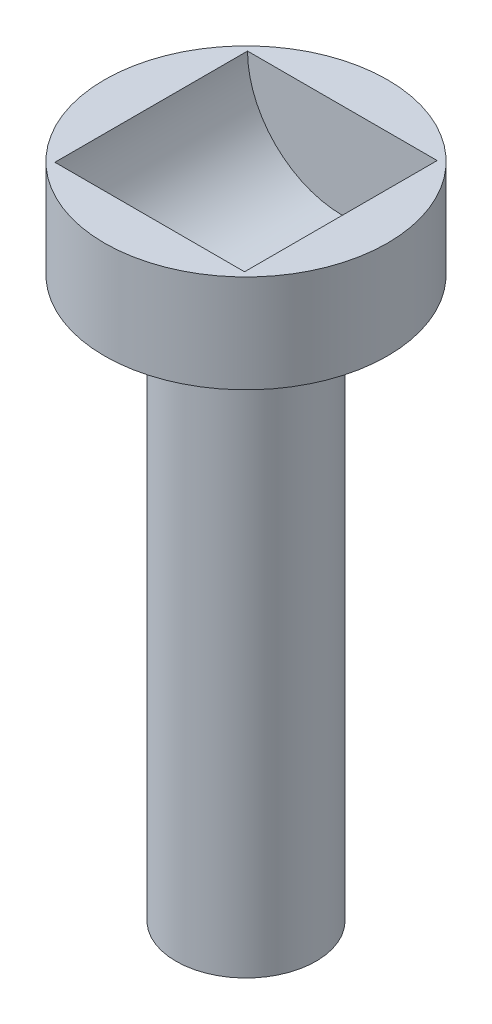
ISO-10303-21;
HEADER;
FILE_DESCRIPTION(('STEP AP214'),'2;1');
FILE_NAME('part.step','',(''),(''),'','','');
FILE_SCHEMA(('AUTOMOTIVE_DESIGN { 1 0 10303 214 1 1 1 1 }'));
ENDSEC;
DATA;
#1=APPLICATION_CONTEXT('core data for automotive mechanical design processes');
#2=APPLICATION_PROTOCOL_DEFINITION('international standard','automotive_design',2000,#1);
#3=PRODUCT_CONTEXT('',#1,'mechanical');
#4=PRODUCT('Part','Part','',(#3));
#5=PRODUCT_RELATED_PRODUCT_CATEGORY('part','',(#4));
#6=PRODUCT_DEFINITION_FORMATION('','',#4);
#7=PRODUCT_DEFINITION_CONTEXT('part definition',#1,'design');
#8=PRODUCT_DEFINITION('design','',#6,#7);
#9=PRODUCT_DEFINITION_SHAPE('','',#8);
#10=(LENGTH_UNIT() NAMED_UNIT(*) SI_UNIT(.MILLI.,.METRE.));
#11=(NAMED_UNIT(*) PLANE_ANGLE_UNIT() SI_UNIT($,.RADIAN.));
#12=(NAMED_UNIT(*) SI_UNIT($,.STERADIAN.) SOLID_ANGLE_UNIT());
#13=UNCERTAINTY_MEASURE_WITH_UNIT(LENGTH_MEASURE(1.E-05),#10,'distance_accuracy_value','');
#14=(GEOMETRIC_REPRESENTATION_CONTEXT(3) GLOBAL_UNCERTAINTY_ASSIGNED_CONTEXT((#13)) GLOBAL_UNIT_ASSIGNED_CONTEXT((#10,
#11,#12)) REPRESENTATION_CONTEXT('',''));
#15=CARTESIAN_POINT('',(0.,0.,0.));
#16=DIRECTION('',(0.,0.,1.));
#17=DIRECTION('',(1.,0.,0.));
#18=AXIS2_PLACEMENT_3D('',#15,#16,#17);
#19=CARTESIAN_POINT('',(0.,20.,0.));
#20=DIRECTION('',(0.,-1.,0.));
#21=DIRECTION('',(0.,0.,-1.));
#22=AXIS2_PLACEMENT_3D('',#19,#20,#21);
#23=CYLINDRICAL_SURFACE('',#22,2.4);
#24=CARTESIAN_POINT('',(0.,0.,0.));
#25=DIRECTION('',(0.,1.,0.));
#26=DIRECTION('',(0.,0.,1.));
#27=AXIS2_PLACEMENT_3D('',#24,#25,#26);
#28=CIRCLE('',#27,2.4);
#29=CARTESIAN_POINT('',(0.,0.,2.4));
#30=VERTEX_POINT('',#29);
#31=EDGE_CURVE('E74',#30,#30,#28,.T.);
#32=ORIENTED_EDGE('',*,*,#31,.T.);
#33=EDGE_LOOP('',(#32));
#34=FACE_BOUND('',#33,.T.);
#35=CARTESIAN_POINT('',(0.,19.19,0.));
#36=DIRECTION('',(0.,1.,0.));
#37=DIRECTION('',(0.,0.,1.));
#38=AXIS2_PLACEMENT_3D('',#35,#36,#37);
#39=CIRCLE('',#38,2.4);
#40=CARTESIAN_POINT('',(0.,19.19,2.4));
#41=VERTEX_POINT('',#40);
#42=EDGE_CURVE('E62',#41,#41,#39,.T.);
#43=ORIENTED_EDGE('',*,*,#42,.F.);
#44=EDGE_LOOP('',(#43));
#45=FACE_BOUND('',#44,.T.);
#46=ADVANCED_FACE('F32',(#34,#45),#23,.T.);
#47=CARTESIAN_POINT('',(0.,0.,0.));
#48=DIRECTION('',(0.,1.,0.));
#49=DIRECTION('',(0.,0.,1.));
#50=AXIS2_PLACEMENT_3D('',#47,#48,#49);
#51=PLANE('',#50);
#52=CARTESIAN_POINT('',(0.,0.,0.));
#53=DIRECTION('',(0.,-1.,0.));
#54=DIRECTION('',(0.,0.,-1.));
#55=AXIS2_PLACEMENT_3D('',#52,#53,#54);
#56=CIRCLE('',#55,1.195);
#57=CARTESIAN_POINT('',(0.,0.,-1.195));
#58=VERTEX_POINT('',#57);
#59=EDGE_CURVE('E78',#58,#58,#56,.T.);
#60=ORIENTED_EDGE('',*,*,#59,.F.);
#61=EDGE_LOOP('',(#60));
#62=FACE_BOUND('',#61,.T.);
#63=ORIENTED_EDGE('',*,*,#31,.F.);
#64=EDGE_LOOP('',(#63));
#65=FACE_BOUND('',#64,.T.);
#66=ADVANCED_FACE('F101',(#62,#65),#51,.F.);
#67=CARTESIAN_POINT('',(0.,10.,0.));
#68=DIRECTION('',(0.,-1.,0.));
#69=DIRECTION('',(0.,0.,-1.));
#70=AXIS2_PLACEMENT_3D('',#67,#68,#69);
#71=CYLINDRICAL_SURFACE('',#70,1.195);
#72=CARTESIAN_POINT('',(0.,10.,0.));
#73=DIRECTION('',(0.,-1.,0.));
#74=DIRECTION('',(0.,0.,-1.));
#75=AXIS2_PLACEMENT_3D('',#72,#73,#74);
#76=CIRCLE('',#75,1.195);
#77=CARTESIAN_POINT('',(0.,10.,-1.195));
#78=VERTEX_POINT('',#77);
#79=EDGE_CURVE('E77',#78,#78,#76,.T.);
#80=ORIENTED_EDGE('',*,*,#79,.F.);
#81=EDGE_LOOP('',(#80));
#82=FACE_BOUND('',#81,.T.);
#83=ORIENTED_EDGE('',*,*,#59,.T.);
#84=EDGE_LOOP('',(#83));
#85=FACE_BOUND('',#84,.T.);
#86=ADVANCED_FACE('F106',(#82,#85),#71,.F.);
#87=CARTESIAN_POINT('',(0.,10.,0.));
#88=DIRECTION('',(0.,-1.,0.));
#89=DIRECTION('',(0.,0.,-1.));
#90=AXIS2_PLACEMENT_3D('',#87,#88,#89);
#91=PLANE('',#90);
#92=ORIENTED_EDGE('',*,*,#79,.T.);
#93=EDGE_LOOP('',(#92));
#94=FACE_BOUND('',#93,.T.);
#95=ADVANCED_FACE('F114',(#94),#91,.T.);
#96=CARTESIAN_POINT('',(0.,19.19,0.));
#97=DIRECTION('',(0.,1.,0.));
#98=DIRECTION('',(0.,0.,1.));
#99=AXIS2_PLACEMENT_3D('',#96,#97,#98);
#100=PLANE('',#99);
#101=CARTESIAN_POINT('',(0.,19.19,0.));
#102=DIRECTION('',(0.,1.,0.));
#103=DIRECTION('',(0.,0.,1.));
#104=AXIS2_PLACEMENT_3D('',#101,#102,#103);
#105=CIRCLE('',#104,4.85);
#106=CARTESIAN_POINT('',(0.,19.19,4.85));
#107=VERTEX_POINT('',#106);
#108=EDGE_CURVE('E86',#107,#107,#105,.T.);
#109=ORIENTED_EDGE('',*,*,#108,.F.);
#110=EDGE_LOOP('',(#109));
#111=FACE_BOUND('',#110,.T.);
#112=ORIENTED_EDGE('',*,*,#42,.T.);
#113=EDGE_LOOP('',(#112));
#114=FACE_BOUND('',#113,.T.);
#115=ADVANCED_FACE('F112',(#111,#114),#100,.F.);
#116=CARTESIAN_POINT('',(0.,22.54,0.));
#117=DIRECTION('',(0.,1.,0.));
#118=DIRECTION('',(0.,0.,1.));
#119=AXIS2_PLACEMENT_3D('',#116,#117,#118);
#120=PLANE('',#119);
#121=DIRECTION('',(1.,0.,0.));
#122=VECTOR('',#121,1.);
#123=CARTESIAN_POINT('',(0.,22.54,3.3));
#124=LINE('',#123,#122);
#125=CARTESIAN_POINT('',(-3.25,22.54,3.3));
#126=VERTEX_POINT('',#125);
#127=CARTESIAN_POINT('',(3.25,22.54,3.3));
#128=VERTEX_POINT('',#127);
#129=EDGE_CURVE('E11',#126,#128,#124,.T.);
#130=ORIENTED_EDGE('',*,*,#129,.F.);
#131=DIRECTION('',(0.,0.,-1.));
#132=VECTOR('',#131,1.);
#133=CARTESIAN_POINT('',(-3.25,22.54,3.3));
#134=LINE('',#133,#132);
#135=CARTESIAN_POINT('',(-3.25,22.54,-3.302));
#136=VERTEX_POINT('',#135);
#137=EDGE_CURVE('E52',#126,#136,#134,.T.);
#138=ORIENTED_EDGE('',*,*,#137,.T.);
#139=DIRECTION('',(1.,0.,0.));
#140=VECTOR('',#139,1.);
#141=CARTESIAN_POINT('',(0.,22.54,-3.302));
#142=LINE('',#141,#140);
#143=CARTESIAN_POINT('',(3.25,22.54,-3.302));
#144=VERTEX_POINT('',#143);
#145=EDGE_CURVE('E58',#136,#144,#142,.T.);
#146=ORIENTED_EDGE('',*,*,#145,.T.);
#147=DIRECTION('',(0.,0.,-1.));
#148=VECTOR('',#147,1.);
#149=CARTESIAN_POINT('',(3.25,22.54,3.3));
#150=LINE('',#149,#148);
#151=EDGE_CURVE('E39',#144,#128,#150,.F.);
#152=ORIENTED_EDGE('',*,*,#151,.T.);
#153=EDGE_LOOP('',(#130,#138,#146,#152));
#154=FACE_BOUND('',#153,.T.);
#155=CARTESIAN_POINT('',(0.,22.54,0.));
#156=DIRECTION('',(0.,1.,0.));
#157=DIRECTION('',(0.,0.,1.));
#158=AXIS2_PLACEMENT_3D('',#155,#156,#157);
#159=CIRCLE('',#158,4.85);
#160=CARTESIAN_POINT('',(0.,22.54,4.85));
#161=VERTEX_POINT('',#160);
#162=EDGE_CURVE('E81',#161,#161,#159,.T.);
#163=ORIENTED_EDGE('',*,*,#162,.T.);
#164=EDGE_LOOP('',(#163));
#165=FACE_BOUND('',#164,.T.);
#166=ADVANCED_FACE('F68',(#154,#165),#120,.T.);
#167=CARTESIAN_POINT('',(0.,22.54,0.));
#168=DIRECTION('',(0.,-1.,0.));
#169=DIRECTION('',(0.,0.,-1.));
#170=AXIS2_PLACEMENT_3D('',#167,#168,#169);
#171=CYLINDRICAL_SURFACE('',#170,4.85);
#172=ORIENTED_EDGE('',*,*,#162,.F.);
#173=EDGE_LOOP('',(#172));
#174=FACE_BOUND('',#173,.T.);
#175=ORIENTED_EDGE('',*,*,#108,.T.);
#176=EDGE_LOOP('',(#175));
#177=FACE_BOUND('',#176,.T.);
#178=ADVANCED_FACE('F98',(#174,#177),#171,.T.);
#179=CARTESIAN_POINT('',(0.,22.54,3.3));
#180=DIRECTION('',(0.,0.,-1.));
#181=DIRECTION('',(-1.,0.,0.));
#182=AXIS2_PLACEMENT_3D('',#179,#180,#181);
#183=CYLINDRICAL_SURFACE('',#182,3.25);
#184=CARTESIAN_POINT('',(0.,22.54,-3.302));
#185=DIRECTION('',(0.,0.,1.));
#186=DIRECTION('',(1.,0.,0.));
#187=AXIS2_PLACEMENT_3D('',#184,#185,#186);
#188=CIRCLE('',#187,3.25);
#189=EDGE_CURVE('E45',#136,#144,#188,.T.);
#190=ORIENTED_EDGE('',*,*,#189,.F.);
#191=ORIENTED_EDGE('',*,*,#137,.F.);
#192=CARTESIAN_POINT('',(0.,22.54,3.3));
#193=DIRECTION('',(0.,0.,1.));
#194=DIRECTION('',(1.,0.,0.));
#195=AXIS2_PLACEMENT_3D('',#192,#193,#194);
#196=CIRCLE('',#195,3.25);
#197=EDGE_CURVE('E65',#126,#128,#196,.T.);
#198=ORIENTED_EDGE('',*,*,#197,.T.);
#199=ORIENTED_EDGE('',*,*,#151,.F.);
#200=EDGE_LOOP('',(#190,#191,#198,#199));
#201=FACE_BOUND('',#200,.T.);
#202=ADVANCED_FACE('F64',(#201),#183,.F.);
#203=CARTESIAN_POINT('',(0.,22.54,3.3));
#204=DIRECTION('',(0.,0.,1.));
#205=DIRECTION('',(1.,0.,0.));
#206=AXIS2_PLACEMENT_3D('',#203,#204,#205);
#207=PLANE('',#206);
#208=ORIENTED_EDGE('',*,*,#129,.T.);
#209=ORIENTED_EDGE('',*,*,#197,.F.);
#210=EDGE_LOOP('',(#208,#209));
#211=FACE_BOUND('',#210,.T.);
#212=ADVANCED_FACE('F90',(#211),#207,.F.);
#213=CARTESIAN_POINT('',(0.,22.54,-3.302));
#214=DIRECTION('',(0.,0.,1.));
#215=DIRECTION('',(1.,0.,0.));
#216=AXIS2_PLACEMENT_3D('',#213,#214,#215);
#217=PLANE('',#216);
#218=ORIENTED_EDGE('',*,*,#189,.T.);
#219=ORIENTED_EDGE('',*,*,#145,.F.);
#220=EDGE_LOOP('',(#218,#219));
#221=FACE_BOUND('',#220,.T.);
#222=ADVANCED_FACE('F59',(#221),#217,.T.);
#223=CLOSED_SHELL('',(#46,#66,#86,#95,#115,#166,#178,#202,#212,#222));
#224=MANIFOLD_SOLID_BREP('B2',#223);
#225=ADVANCED_BREP_SHAPE_REPRESENTATION('',(#18,#224),#14);
#226=SHAPE_DEFINITION_REPRESENTATION(#9,#225);
ENDSEC;
END-ISO-10303-21;
